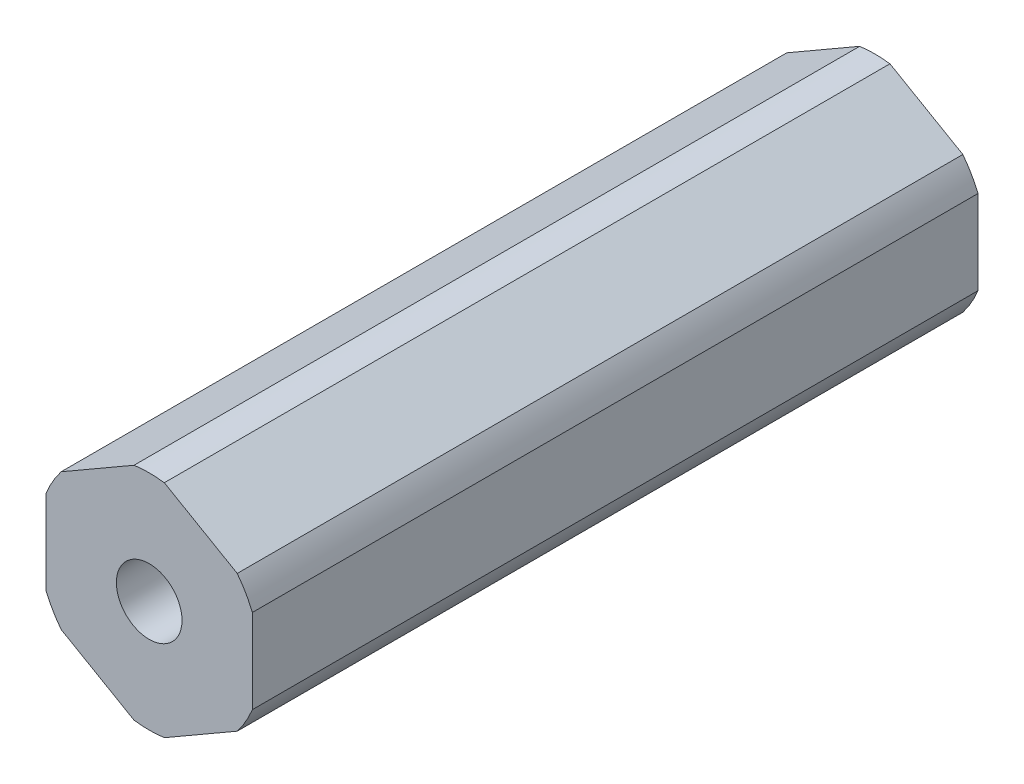
ISO-10303-21;
HEADER;
FILE_DESCRIPTION(('STEP AP214'),'2;1');
FILE_NAME('part.step','',(''),(''),'','','');
FILE_SCHEMA(('AUTOMOTIVE_DESIGN { 1 0 10303 214 1 1 1 1 }'));
ENDSEC;
DATA;
#1=APPLICATION_CONTEXT('core data for automotive mechanical design processes');
#2=APPLICATION_PROTOCOL_DEFINITION('international standard','automotive_design',2000,#1);
#3=PRODUCT_CONTEXT('',#1,'mechanical');
#4=PRODUCT('Part','Part','',(#3));
#5=PRODUCT_RELATED_PRODUCT_CATEGORY('part','',(#4));
#6=PRODUCT_DEFINITION_FORMATION('','',#4);
#7=PRODUCT_DEFINITION_CONTEXT('part definition',#1,'design');
#8=PRODUCT_DEFINITION('design','',#6,#7);
#9=PRODUCT_DEFINITION_SHAPE('','',#8);
#10=(LENGTH_UNIT() NAMED_UNIT(*) SI_UNIT(.MILLI.,.METRE.));
#11=(NAMED_UNIT(*) PLANE_ANGLE_UNIT() SI_UNIT($,.RADIAN.));
#12=(NAMED_UNIT(*) SI_UNIT($,.STERADIAN.) SOLID_ANGLE_UNIT());
#13=UNCERTAINTY_MEASURE_WITH_UNIT(LENGTH_MEASURE(1.E-05),#10,'distance_accuracy_value','');
#14=(GEOMETRIC_REPRESENTATION_CONTEXT(3) GLOBAL_UNCERTAINTY_ASSIGNED_CONTEXT((#13)) GLOBAL_UNIT_ASSIGNED_CONTEXT((#10,
#11,#12)) REPRESENTATION_CONTEXT('',''));
#15=CARTESIAN_POINT('',(0.,0.,0.));
#16=DIRECTION('',(0.,0.,1.));
#17=DIRECTION('',(1.,0.,0.));
#18=AXIS2_PLACEMENT_3D('',#15,#16,#17);
#19=CARTESIAN_POINT('',(6.35,0.,22.3266));
#20=DIRECTION('',(-1.,0.,0.));
#21=DIRECTION('',(0.,0.,1.));
#22=AXIS2_PLACEMENT_3D('',#19,#20,#21);
#23=PLANE('',#22);
#24=DIRECTION('',(0.,1.,0.));
#25=VECTOR('',#24,1.);
#26=CARTESIAN_POINT('',(6.35,0.,-22.3266));
#27=LINE('',#26,#25);
#28=CARTESIAN_POINT('',(6.35,-2.59030191290513,-22.3266));
#29=VERTEX_POINT('',#28);
#30=CARTESIAN_POINT('',(6.35,2.59030191290513,-22.3266));
#31=VERTEX_POINT('',#30);
#32=EDGE_CURVE('E173',#29,#31,#27,.T.);
#33=ORIENTED_EDGE('',*,*,#32,.T.);
#34=DIRECTION('',(0.,0.,-1.));
#35=VECTOR('',#34,1.);
#36=CARTESIAN_POINT('',(6.35,2.59030191290513,22.3266));
#37=LINE('',#36,#35);
#38=CARTESIAN_POINT('',(6.35,2.59030191290513,22.3266));
#39=VERTEX_POINT('',#38);
#40=EDGE_CURVE('E11',#39,#31,#37,.T.);
#41=ORIENTED_EDGE('',*,*,#40,.F.);
#42=DIRECTION('',(0.,1.,0.));
#43=VECTOR('',#42,1.);
#44=CARTESIAN_POINT('',(6.35,0.,22.3266));
#45=LINE('',#44,#43);
#46=CARTESIAN_POINT('',(6.35,-2.59030191290513,22.3266));
#47=VERTEX_POINT('',#46);
#48=EDGE_CURVE('E253',#47,#39,#45,.T.);
#49=ORIENTED_EDGE('',*,*,#48,.F.);
#50=DIRECTION('',(0.,0.,-1.));
#51=VECTOR('',#50,1.);
#52=CARTESIAN_POINT('',(6.35,-2.59030191290513,22.3266));
#53=LINE('',#52,#51);
#54=EDGE_CURVE('E169',#47,#29,#53,.T.);
#55=ORIENTED_EDGE('',*,*,#54,.T.);
#56=EDGE_LOOP('',(#33,#41,#49,#55));
#57=FACE_BOUND('',#56,.T.);
#58=ADVANCED_FACE('F47',(#57),#23,.F.);
#59=CARTESIAN_POINT('',(0.,0.,22.3266));
#60=DIRECTION('',(0.,0.,-1.));
#61=DIRECTION('',(-1.,0.,0.));
#62=AXIS2_PLACEMENT_3D('',#59,#60,#61);
#63=CYLINDRICAL_SURFACE('',#62,6.858);
#64=CARTESIAN_POINT('',(0.,0.,-22.3266));
#65=DIRECTION('',(0.,0.,1.));
#66=DIRECTION('',(1.,0.,0.));
#67=AXIS2_PLACEMENT_3D('',#64,#65,#66);
#68=CIRCLE('',#67,6.858);
#69=CARTESIAN_POINT('',(5.41826726004727,4.20411035757862,-22.3266));
#70=VERTEX_POINT('',#69);
#71=EDGE_CURVE('E177',#31,#70,#68,.T.);
#72=ORIENTED_EDGE('',*,*,#71,.T.);
#73=DIRECTION('',(0.,0.,-1.));
#74=VECTOR('',#73,1.);
#75=CARTESIAN_POINT('',(5.41826726004727,4.20411035757862,22.3266));
#76=LINE('',#75,#74);
#77=CARTESIAN_POINT('',(5.41826726004727,4.20411035757862,22.3266));
#78=VERTEX_POINT('',#77);
#79=EDGE_CURVE('E56',#78,#70,#76,.T.);
#80=ORIENTED_EDGE('',*,*,#79,.F.);
#81=CARTESIAN_POINT('',(0.,0.,22.3266));
#82=DIRECTION('',(0.,0.,1.));
#83=DIRECTION('',(1.,0.,0.));
#84=AXIS2_PLACEMENT_3D('',#81,#82,#83);
#85=CIRCLE('',#84,6.858);
#86=EDGE_CURVE('E119',#39,#78,#85,.T.);
#87=ORIENTED_EDGE('',*,*,#86,.F.);
#88=ORIENTED_EDGE('',*,*,#40,.T.);
#89=EDGE_LOOP('',(#72,#80,#87,#88));
#90=FACE_BOUND('',#89,.T.);
#91=ADVANCED_FACE('F297',(#90),#63,.T.);
#92=CARTESIAN_POINT('',(3.175,5.49926131403119,22.3266));
#93=DIRECTION('',(-0.5,-0.866025403784439,0.));
#94=DIRECTION('',(0.866025403784439,-0.5,0.));
#95=AXIS2_PLACEMENT_3D('',#92,#93,#94);
#96=PLANE('',#95);
#97=DIRECTION('',(-0.866025403784439,0.5,0.));
#98=VECTOR('',#97,1.);
#99=CARTESIAN_POINT('',(3.175,5.49926131403119,-22.3266));
#100=LINE('',#99,#98);
#101=CARTESIAN_POINT('',(0.931732739952734,6.79441227048375,-22.3266));
#102=VERTEX_POINT('',#101);
#103=EDGE_CURVE('E181',#70,#102,#100,.T.);
#104=ORIENTED_EDGE('',*,*,#103,.T.);
#105=DIRECTION('',(0.,0.,-1.));
#106=VECTOR('',#105,1.);
#107=CARTESIAN_POINT('',(0.931732739952734,6.79441227048375,22.3266));
#108=LINE('',#107,#106);
#109=CARTESIAN_POINT('',(0.931732739952734,6.79441227048375,22.3266));
#110=VERTEX_POINT('',#109);
#111=EDGE_CURVE('E224',#110,#102,#108,.T.);
#112=ORIENTED_EDGE('',*,*,#111,.F.);
#113=DIRECTION('',(-0.866025403784439,0.5,0.));
#114=VECTOR('',#113,1.);
#115=CARTESIAN_POINT('',(3.175,5.49926131403119,22.3266));
#116=LINE('',#115,#114);
#117=EDGE_CURVE('E234',#78,#110,#116,.T.);
#118=ORIENTED_EDGE('',*,*,#117,.F.);
#119=ORIENTED_EDGE('',*,*,#79,.T.);
#120=EDGE_LOOP('',(#104,#112,#118,#119));
#121=FACE_BOUND('',#120,.T.);
#122=ADVANCED_FACE('F232',(#121),#96,.F.);
#123=CARTESIAN_POINT('',(-0.93173273995273,6.79441227048375,-22.3266));
#124=VERTEX_POINT('',#123);
#125=EDGE_CURVE('E182',#102,#124,#68,.T.);
#126=ORIENTED_EDGE('',*,*,#125,.T.);
#127=DIRECTION('',(0.,0.,-1.));
#128=VECTOR('',#127,1.);
#129=CARTESIAN_POINT('',(-0.93173273995273,6.79441227048375,22.3266));
#130=LINE('',#129,#128);
#131=CARTESIAN_POINT('',(-0.93173273995273,6.79441227048375,22.3266));
#132=VERTEX_POINT('',#131);
#133=EDGE_CURVE('E220',#132,#124,#130,.T.);
#134=ORIENTED_EDGE('',*,*,#133,.F.);
#135=EDGE_CURVE('E259',#110,#132,#85,.T.);
#136=ORIENTED_EDGE('',*,*,#135,.F.);
#137=ORIENTED_EDGE('',*,*,#111,.T.);
#138=EDGE_LOOP('',(#126,#134,#136,#137));
#139=FACE_BOUND('',#138,.T.);
#140=ADVANCED_FACE('F280',(#139),#63,.T.);
#141=CARTESIAN_POINT('',(-3.175,5.49926131403119,22.3266));
#142=DIRECTION('',(0.5,-0.866025403784439,0.));
#143=DIRECTION('',(0.866025403784439,0.5,0.));
#144=AXIS2_PLACEMENT_3D('',#141,#142,#143);
#145=PLANE('',#144);
#146=DIRECTION('',(-0.866025403784439,-0.5,0.));
#147=VECTOR('',#146,1.);
#148=CARTESIAN_POINT('',(-3.175,5.49926131403119,-22.3266));
#149=LINE('',#148,#147);
#150=CARTESIAN_POINT('',(-5.41826726004727,4.20411035757862,-22.3266));
#151=VERTEX_POINT('',#150);
#152=EDGE_CURVE('E185',#124,#151,#149,.T.);
#153=ORIENTED_EDGE('',*,*,#152,.T.);
#154=DIRECTION('',(0.,0.,-1.));
#155=VECTOR('',#154,1.);
#156=CARTESIAN_POINT('',(-5.41826726004727,4.20411035757862,22.3266));
#157=LINE('',#156,#155);
#158=CARTESIAN_POINT('',(-5.41826726004727,4.20411035757862,22.3266));
#159=VERTEX_POINT('',#158);
#160=EDGE_CURVE('E216',#159,#151,#157,.T.);
#161=ORIENTED_EDGE('',*,*,#160,.F.);
#162=DIRECTION('',(-0.866025403784439,-0.5,0.));
#163=VECTOR('',#162,1.);
#164=CARTESIAN_POINT('',(-3.175,5.49926131403119,22.3266));
#165=LINE('',#164,#163);
#166=EDGE_CURVE('E266',#132,#159,#165,.T.);
#167=ORIENTED_EDGE('',*,*,#166,.F.);
#168=ORIENTED_EDGE('',*,*,#133,.T.);
#169=EDGE_LOOP('',(#153,#161,#167,#168));
#170=FACE_BOUND('',#169,.T.);
#171=ADVANCED_FACE('F282',(#170),#145,.F.);
#172=CARTESIAN_POINT('',(-6.35,2.59030191290513,-22.3266));
#173=VERTEX_POINT('',#172);
#174=EDGE_CURVE('E188',#151,#173,#68,.T.);
#175=ORIENTED_EDGE('',*,*,#174,.T.);
#176=DIRECTION('',(0.,0.,-1.));
#177=VECTOR('',#176,1.);
#178=CARTESIAN_POINT('',(-6.35,2.59030191290513,22.3266));
#179=LINE('',#178,#177);
#180=CARTESIAN_POINT('',(-6.35,2.59030191290513,22.3266));
#181=VERTEX_POINT('',#180);
#182=EDGE_CURVE('E212',#181,#173,#179,.T.);
#183=ORIENTED_EDGE('',*,*,#182,.F.);
#184=EDGE_CURVE('E268',#159,#181,#85,.T.);
#185=ORIENTED_EDGE('',*,*,#184,.F.);
#186=ORIENTED_EDGE('',*,*,#160,.T.);
#187=EDGE_LOOP('',(#175,#183,#185,#186));
#188=FACE_BOUND('',#187,.T.);
#189=ADVANCED_FACE('F283',(#188),#63,.T.);
#190=CARTESIAN_POINT('',(-6.35,0.,22.3266));
#191=DIRECTION('',(1.,0.,0.));
#192=DIRECTION('',(0.,1.,0.));
#193=AXIS2_PLACEMENT_3D('',#190,#191,#192);
#194=PLANE('',#193);
#195=DIRECTION('',(0.,-1.,0.));
#196=VECTOR('',#195,1.);
#197=CARTESIAN_POINT('',(-6.35,0.,-22.3266));
#198=LINE('',#197,#196);
#199=CARTESIAN_POINT('',(-6.35,-2.59030191290514,-22.3266));
#200=VERTEX_POINT('',#199);
#201=EDGE_CURVE('E189',#173,#200,#198,.T.);
#202=ORIENTED_EDGE('',*,*,#201,.T.);
#203=DIRECTION('',(0.,0.,-1.));
#204=VECTOR('',#203,1.);
#205=CARTESIAN_POINT('',(-6.35,-2.59030191290514,22.3266));
#206=LINE('',#205,#204);
#207=CARTESIAN_POINT('',(-6.35,-2.59030191290514,22.3266));
#208=VERTEX_POINT('',#207);
#209=EDGE_CURVE('E208',#208,#200,#206,.T.);
#210=ORIENTED_EDGE('',*,*,#209,.F.);
#211=DIRECTION('',(0.,-1.,0.));
#212=VECTOR('',#211,1.);
#213=CARTESIAN_POINT('',(-6.35,0.,22.3266));
#214=LINE('',#213,#212);
#215=EDGE_CURVE('E269',#181,#208,#214,.T.);
#216=ORIENTED_EDGE('',*,*,#215,.F.);
#217=ORIENTED_EDGE('',*,*,#182,.T.);
#218=EDGE_LOOP('',(#202,#210,#216,#217));
#219=FACE_BOUND('',#218,.T.);
#220=ADVANCED_FACE('F286',(#219),#194,.F.);
#221=CARTESIAN_POINT('',(-5.41826726004727,-4.20411035757862,-22.3266));
#222=VERTEX_POINT('',#221);
#223=EDGE_CURVE('E192',#200,#222,#68,.T.);
#224=ORIENTED_EDGE('',*,*,#223,.T.);
#225=DIRECTION('',(0.,0.,-1.));
#226=VECTOR('',#225,1.);
#227=CARTESIAN_POINT('',(-5.41826726004727,-4.20411035757862,22.3266));
#228=LINE('',#227,#226);
#229=CARTESIAN_POINT('',(-5.41826726004727,-4.20411035757862,22.3266));
#230=VERTEX_POINT('',#229);
#231=EDGE_CURVE('E204',#230,#222,#228,.T.);
#232=ORIENTED_EDGE('',*,*,#231,.F.);
#233=EDGE_CURVE('E156',#208,#230,#85,.T.);
#234=ORIENTED_EDGE('',*,*,#233,.F.);
#235=ORIENTED_EDGE('',*,*,#209,.T.);
#236=EDGE_LOOP('',(#224,#232,#234,#235));
#237=FACE_BOUND('',#236,.T.);
#238=ADVANCED_FACE('F288',(#237),#63,.T.);
#239=CARTESIAN_POINT('',(-3.175,-5.49926131403119,22.3266));
#240=DIRECTION('',(0.5,0.866025403784439,0.));
#241=DIRECTION('',(-0.866025403784439,0.5,0.));
#242=AXIS2_PLACEMENT_3D('',#239,#240,#241);
#243=PLANE('',#242);
#244=DIRECTION('',(0.866025403784439,-0.5,0.));
#245=VECTOR('',#244,1.);
#246=CARTESIAN_POINT('',(-3.175,-5.49926131403119,-22.3266));
#247=LINE('',#246,#245);
#248=CARTESIAN_POINT('',(-0.931732739952729,-6.79441227048375,-22.3266));
#249=VERTEX_POINT('',#248);
#250=EDGE_CURVE('E193',#222,#249,#247,.T.);
#251=ORIENTED_EDGE('',*,*,#250,.T.);
#252=DIRECTION('',(0.,0.,-1.));
#253=VECTOR('',#252,1.);
#254=CARTESIAN_POINT('',(-0.931732739952729,-6.79441227048375,22.3266));
#255=LINE('',#254,#253);
#256=CARTESIAN_POINT('',(-0.931732739952729,-6.79441227048375,22.3266));
#257=VERTEX_POINT('',#256);
#258=EDGE_CURVE('E162',#257,#249,#255,.T.);
#259=ORIENTED_EDGE('',*,*,#258,.F.);
#260=DIRECTION('',(0.866025403784439,-0.5,0.));
#261=VECTOR('',#260,1.);
#262=CARTESIAN_POINT('',(-3.175,-5.49926131403119,22.3266));
#263=LINE('',#262,#261);
#264=EDGE_CURVE('E150',#230,#257,#263,.T.);
#265=ORIENTED_EDGE('',*,*,#264,.F.);
#266=ORIENTED_EDGE('',*,*,#231,.T.);
#267=EDGE_LOOP('',(#251,#259,#265,#266));
#268=FACE_BOUND('',#267,.T.);
#269=ADVANCED_FACE('F291',(#268),#243,.F.);
#270=CARTESIAN_POINT('',(0.931732739952732,-6.79441227048375,-22.3266));
#271=VERTEX_POINT('',#270);
#272=EDGE_CURVE('E160',#249,#271,#68,.T.);
#273=ORIENTED_EDGE('',*,*,#272,.T.);
#274=DIRECTION('',(0.,0.,-1.));
#275=VECTOR('',#274,1.);
#276=CARTESIAN_POINT('',(0.931732739952732,-6.79441227048375,22.3266));
#277=LINE('',#276,#275);
#278=CARTESIAN_POINT('',(0.931732739952732,-6.79441227048375,22.3266));
#279=VERTEX_POINT('',#278);
#280=EDGE_CURVE('E157',#279,#271,#277,.T.);
#281=ORIENTED_EDGE('',*,*,#280,.F.);
#282=EDGE_CURVE('E144',#257,#279,#85,.T.);
#283=ORIENTED_EDGE('',*,*,#282,.F.);
#284=ORIENTED_EDGE('',*,*,#258,.T.);
#285=EDGE_LOOP('',(#273,#281,#283,#284));
#286=FACE_BOUND('',#285,.T.);
#287=ADVANCED_FACE('F158',(#286),#63,.T.);
#288=CARTESIAN_POINT('',(3.175,-5.49926131403119,22.3266));
#289=DIRECTION('',(-0.5,0.866025403784439,0.));
#290=DIRECTION('',(-0.866025403784439,-0.5,0.));
#291=AXIS2_PLACEMENT_3D('',#288,#289,#290);
#292=PLANE('',#291);
#293=DIRECTION('',(0.866025403784439,0.5,0.));
#294=VECTOR('',#293,1.);
#295=CARTESIAN_POINT('',(3.175,-5.49926131403119,-22.3266));
#296=LINE('',#295,#294);
#297=CARTESIAN_POINT('',(5.41826726004727,-4.20411035757863,-22.3266));
#298=VERTEX_POINT('',#297);
#299=EDGE_CURVE('E105',#271,#298,#296,.T.);
#300=ORIENTED_EDGE('',*,*,#299,.T.);
#301=DIRECTION('',(0.,0.,-1.));
#302=VECTOR('',#301,1.);
#303=CARTESIAN_POINT('',(5.41826726004727,-4.20411035757863,22.3266));
#304=LINE('',#303,#302);
#305=CARTESIAN_POINT('',(5.41826726004727,-4.20411035757863,22.3266));
#306=VERTEX_POINT('',#305);
#307=EDGE_CURVE('E163',#306,#298,#304,.T.);
#308=ORIENTED_EDGE('',*,*,#307,.F.);
#309=DIRECTION('',(0.866025403784439,0.5,0.));
#310=VECTOR('',#309,1.);
#311=CARTESIAN_POINT('',(3.175,-5.49926131403119,22.3266));
#312=LINE('',#311,#310);
#313=EDGE_CURVE('E148',#279,#306,#312,.T.);
#314=ORIENTED_EDGE('',*,*,#313,.F.);
#315=ORIENTED_EDGE('',*,*,#280,.T.);
#316=EDGE_LOOP('',(#300,#308,#314,#315));
#317=FACE_BOUND('',#316,.T.);
#318=ADVANCED_FACE('F165',(#317),#292,.F.);
#319=EDGE_CURVE('E111',#298,#29,#68,.T.);
#320=ORIENTED_EDGE('',*,*,#319,.T.);
#321=ORIENTED_EDGE('',*,*,#54,.F.);
#322=EDGE_CURVE('E64',#306,#47,#85,.T.);
#323=ORIENTED_EDGE('',*,*,#322,.F.);
#324=ORIENTED_EDGE('',*,*,#307,.T.);
#325=EDGE_LOOP('',(#320,#321,#323,#324));
#326=FACE_BOUND('',#325,.T.);
#327=ADVANCED_FACE('F294',(#326),#63,.T.);
#328=CARTESIAN_POINT('',(0.,0.,22.3266));
#329=DIRECTION('',(0.,0.,1.));
#330=DIRECTION('',(1.,0.,0.));
#331=AXIS2_PLACEMENT_3D('',#328,#329,#330);
#332=PLANE('',#331);
#333=CARTESIAN_POINT('',(0.,0.,22.3266));
#334=DIRECTION('',(0.,0.,1.));
#335=DIRECTION('',(1.,0.,0.));
#336=AXIS2_PLACEMENT_3D('',#333,#334,#335);
#337=CIRCLE('',#336,2.0193);
#338=CARTESIAN_POINT('',(2.0193,0.,22.3266));
#339=VERTEX_POINT('',#338);
#340=EDGE_CURVE('E261',#339,#339,#337,.T.);
#341=ORIENTED_EDGE('',*,*,#340,.F.);
#342=EDGE_LOOP('',(#341));
#343=FACE_BOUND('',#342,.T.);
#344=ORIENTED_EDGE('',*,*,#48,.T.);
#345=ORIENTED_EDGE('',*,*,#86,.T.);
#346=ORIENTED_EDGE('',*,*,#117,.T.);
#347=ORIENTED_EDGE('',*,*,#135,.T.);
#348=ORIENTED_EDGE('',*,*,#166,.T.);
#349=ORIENTED_EDGE('',*,*,#184,.T.);
#350=ORIENTED_EDGE('',*,*,#215,.T.);
#351=ORIENTED_EDGE('',*,*,#233,.T.);
#352=ORIENTED_EDGE('',*,*,#264,.T.);
#353=ORIENTED_EDGE('',*,*,#282,.T.);
#354=ORIENTED_EDGE('',*,*,#313,.T.);
#355=ORIENTED_EDGE('',*,*,#322,.T.);
#356=EDGE_LOOP('',(#344,#345,#346,#347,#348,#349,#350,#351,#352,#353,#354,#355));
#357=FACE_BOUND('',#356,.T.);
#358=ADVANCED_FACE('F146',(#343,#357),#332,.T.);
#359=CARTESIAN_POINT('',(0.,0.,-22.3266));
#360=DIRECTION('',(0.,0.,1.));
#361=DIRECTION('',(1.,0.,0.));
#362=AXIS2_PLACEMENT_3D('',#359,#360,#361);
#363=PLANE('',#362);
#364=CARTESIAN_POINT('',(0.,0.,-22.3266));
#365=DIRECTION('',(0.,0.,1.));
#366=DIRECTION('',(1.,0.,0.));
#367=AXIS2_PLACEMENT_3D('',#364,#365,#366);
#368=CIRCLE('',#367,2.0193);
#369=CARTESIAN_POINT('',(2.0193,0.,-22.3266));
#370=VERTEX_POINT('',#369);
#371=EDGE_CURVE('E178',#370,#370,#368,.T.);
#372=ORIENTED_EDGE('',*,*,#371,.T.);
#373=EDGE_LOOP('',(#372));
#374=FACE_BOUND('',#373,.T.);
#375=ORIENTED_EDGE('',*,*,#32,.F.);
#376=ORIENTED_EDGE('',*,*,#319,.F.);
#377=ORIENTED_EDGE('',*,*,#299,.F.);
#378=ORIENTED_EDGE('',*,*,#272,.F.);
#379=ORIENTED_EDGE('',*,*,#250,.F.);
#380=ORIENTED_EDGE('',*,*,#223,.F.);
#381=ORIENTED_EDGE('',*,*,#201,.F.);
#382=ORIENTED_EDGE('',*,*,#174,.F.);
#383=ORIENTED_EDGE('',*,*,#152,.F.);
#384=ORIENTED_EDGE('',*,*,#125,.F.);
#385=ORIENTED_EDGE('',*,*,#103,.F.);
#386=ORIENTED_EDGE('',*,*,#71,.F.);
#387=EDGE_LOOP('',(#375,#376,#377,#378,#379,#380,#381,#382,#383,#384,#385,#386));
#388=FACE_BOUND('',#387,.T.);
#389=ADVANCED_FACE('F238',(#374,#388),#363,.F.);
#390=CARTESIAN_POINT('',(0.,0.,-22.3266));
#391=DIRECTION('',(0.,0.,1.));
#392=DIRECTION('',(1.,0.,0.));
#393=AXIS2_PLACEMENT_3D('',#390,#391,#392);
#394=CYLINDRICAL_SURFACE('',#393,2.0193);
#395=ORIENTED_EDGE('',*,*,#371,.F.);
#396=EDGE_LOOP('',(#395));
#397=FACE_BOUND('',#396,.T.);
#398=ORIENTED_EDGE('',*,*,#340,.T.);
#399=EDGE_LOOP('',(#398));
#400=FACE_BOUND('',#399,.T.);
#401=ADVANCED_FACE('F391',(#397,#400),#394,.F.);
#402=CLOSED_SHELL('',(#58,#91,#122,#140,#171,#189,#220,#238,#269,#287,#318,#327,#358,#389,#401));
#403=MANIFOLD_SOLID_BREP('B2',#402);
#404=ADVANCED_BREP_SHAPE_REPRESENTATION('',(#18,#403),#14);
#405=SHAPE_DEFINITION_REPRESENTATION(#9,#404);
ENDSEC;
END-ISO-10303-21;
